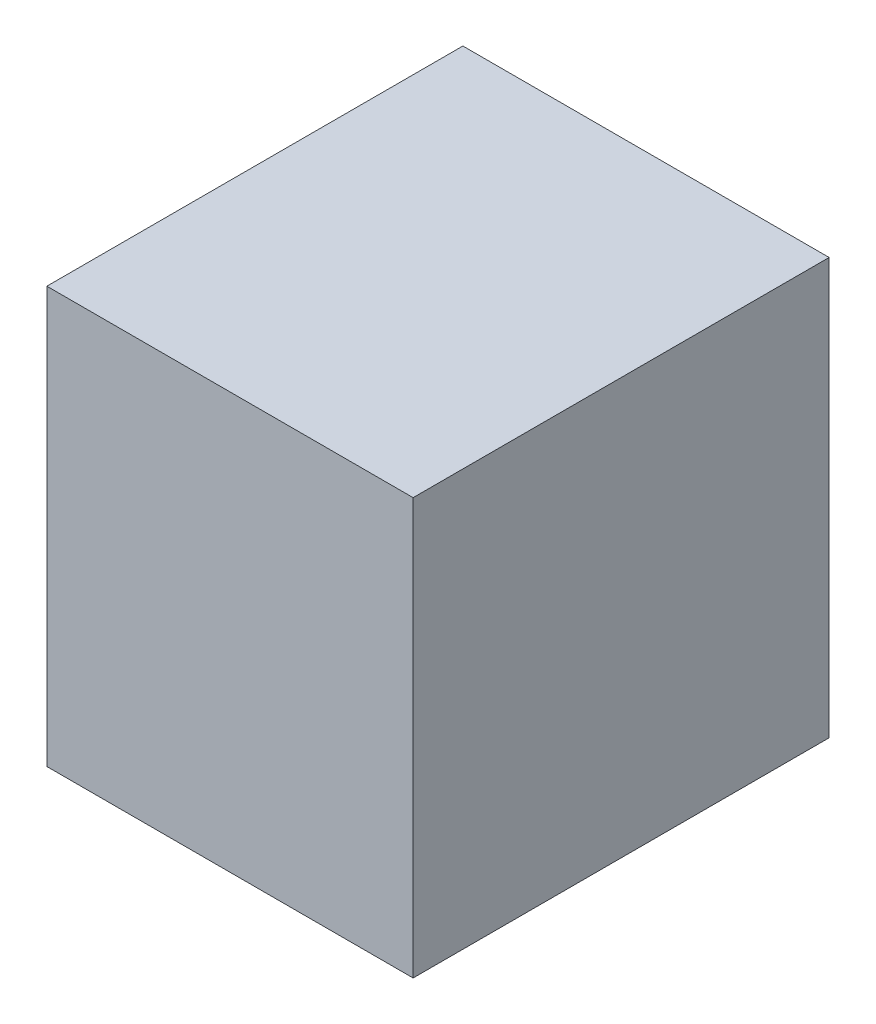
ISO-10303-21;
HEADER;
FILE_DESCRIPTION(('STEP AP214'),'2;1');
FILE_NAME('part.step','',(''),(''),'','','');
FILE_SCHEMA(('AUTOMOTIVE_DESIGN { 1 0 10303 214 1 1 1 1 }'));
ENDSEC;
DATA;
#1=APPLICATION_CONTEXT('core data for automotive mechanical design processes');
#2=APPLICATION_PROTOCOL_DEFINITION('international standard','automotive_design',2000,#1);
#3=PRODUCT_CONTEXT('',#1,'mechanical');
#4=PRODUCT('Part','Part','',(#3));
#5=PRODUCT_RELATED_PRODUCT_CATEGORY('part','',(#4));
#6=PRODUCT_DEFINITION_FORMATION('','',#4);
#7=PRODUCT_DEFINITION_CONTEXT('part definition',#1,'design');
#8=PRODUCT_DEFINITION('design','',#6,#7);
#9=PRODUCT_DEFINITION_SHAPE('','',#8);
#10=(LENGTH_UNIT() NAMED_UNIT(*) SI_UNIT(.MILLI.,.METRE.));
#11=(NAMED_UNIT(*) PLANE_ANGLE_UNIT() SI_UNIT($,.RADIAN.));
#12=(NAMED_UNIT(*) SI_UNIT($,.STERADIAN.) SOLID_ANGLE_UNIT());
#13=UNCERTAINTY_MEASURE_WITH_UNIT(LENGTH_MEASURE(1.E-05),#10,'distance_accuracy_value','');
#14=(GEOMETRIC_REPRESENTATION_CONTEXT(3) GLOBAL_UNCERTAINTY_ASSIGNED_CONTEXT((#13)) GLOBAL_UNIT_ASSIGNED_CONTEXT((#10,
#11,#12)) REPRESENTATION_CONTEXT('',''));
#15=CARTESIAN_POINT('',(0.,0.,0.));
#16=DIRECTION('',(0.,0.,1.));
#17=DIRECTION('',(1.,0.,0.));
#18=AXIS2_PLACEMENT_3D('',#15,#16,#17);
#19=CARTESIAN_POINT('',(86.25,200.,-100.));
#20=DIRECTION('',(-1.,0.,0.));
#21=DIRECTION('',(0.,0.,1.));
#22=AXIS2_PLACEMENT_3D('',#19,#20,#21);
#23=PLANE('',#22);
#24=DIRECTION('',(0.,0.,-1.));
#25=VECTOR('',#24,1.);
#26=CARTESIAN_POINT('',(86.25,0.,-100.));
#27=LINE('',#26,#25);
#28=CARTESIAN_POINT('',(86.25,0.,100.));
#29=VERTEX_POINT('',#28);
#30=CARTESIAN_POINT('',(86.25,0.,-100.));
#31=VERTEX_POINT('',#30);
#32=EDGE_CURVE('E141',#29,#31,#27,.T.);
#33=ORIENTED_EDGE('',*,*,#32,.F.);
#34=DIRECTION('',(0.,-1.,0.));
#35=VECTOR('',#34,1.);
#36=CARTESIAN_POINT('',(86.25,200.,100.));
#37=LINE('',#36,#35);
#38=CARTESIAN_POINT('',(86.25,200.,100.));
#39=VERTEX_POINT('',#38);
#40=EDGE_CURVE('E180',#39,#29,#37,.T.);
#41=ORIENTED_EDGE('',*,*,#40,.F.);
#42=DIRECTION('',(0.,0.,-1.));
#43=VECTOR('',#42,1.);
#44=CARTESIAN_POINT('',(86.25,200.,-100.));
#45=LINE('',#44,#43);
#46=CARTESIAN_POINT('',(86.25,200.,-100.));
#47=VERTEX_POINT('',#46);
#48=EDGE_CURVE('E166',#39,#47,#45,.T.);
#49=ORIENTED_EDGE('',*,*,#48,.T.);
#50=DIRECTION('',(0.,-1.,0.));
#51=VECTOR('',#50,1.);
#52=CARTESIAN_POINT('',(86.25,200.,-100.));
#53=LINE('',#52,#51);
#54=EDGE_CURVE('E177',#47,#31,#53,.T.);
#55=ORIENTED_EDGE('',*,*,#54,.T.);
#56=EDGE_LOOP('',(#33,#41,#49,#55));
#57=FACE_BOUND('',#56,.T.);
#58=ADVANCED_FACE('F41',(#57),#23,.T.);
#59=CARTESIAN_POINT('',(-86.25,200.,-100.));
#60=DIRECTION('',(0.,0.,1.));
#61=DIRECTION('',(1.,0.,0.));
#62=AXIS2_PLACEMENT_3D('',#59,#60,#61);
#63=PLANE('',#62);
#64=DIRECTION('',(-1.,0.,0.));
#65=VECTOR('',#64,1.);
#66=CARTESIAN_POINT('',(-86.25,0.,-100.));
#67=LINE('',#66,#65);
#68=CARTESIAN_POINT('',(-86.25,0.,-100.));
#69=VERTEX_POINT('',#68);
#70=EDGE_CURVE('E60',#31,#69,#67,.T.);
#71=ORIENTED_EDGE('',*,*,#70,.F.);
#72=ORIENTED_EDGE('',*,*,#54,.F.);
#73=DIRECTION('',(-1.,0.,0.));
#74=VECTOR('',#73,1.);
#75=CARTESIAN_POINT('',(-86.25,200.,-100.));
#76=LINE('',#75,#74);
#77=CARTESIAN_POINT('',(-86.25,200.,-100.));
#78=VERTEX_POINT('',#77);
#79=EDGE_CURVE('E83',#47,#78,#76,.T.);
#80=ORIENTED_EDGE('',*,*,#79,.T.);
#81=DIRECTION('',(0.,-1.,0.));
#82=VECTOR('',#81,1.);
#83=CARTESIAN_POINT('',(-86.25,200.,-100.));
#84=LINE('',#83,#82);
#85=EDGE_CURVE('E173',#78,#69,#84,.T.);
#86=ORIENTED_EDGE('',*,*,#85,.T.);
#87=EDGE_LOOP('',(#71,#72,#80,#86));
#88=FACE_BOUND('',#87,.T.);
#89=ADVANCED_FACE('F186',(#88),#63,.T.);
#90=CARTESIAN_POINT('',(-86.25,200.,-100.));
#91=DIRECTION('',(1.,0.,0.));
#92=DIRECTION('',(0.,0.,-1.));
#93=AXIS2_PLACEMENT_3D('',#90,#91,#92);
#94=PLANE('',#93);
#95=CARTESIAN_POINT('',(-86.25,98.9895952736163,1.01040472638368));
#96=DIRECTION('',(1.,0.,0.));
#97=DIRECTION('',(0.,0.,-1.));
#98=AXIS2_PLACEMENT_3D('',#95,#96,#97);
#99=CIRCLE('',#98,72.5);
#100=CARTESIAN_POINT('',(-86.25,98.9895952736163,-71.4895952736163));
#101=VERTEX_POINT('',#100);
#102=EDGE_CURVE('E45',#101,#101,#99,.T.);
#103=ORIENTED_EDGE('',*,*,#102,.F.);
#104=EDGE_LOOP('',(#103));
#105=FACE_BOUND('',#104,.T.);
#106=DIRECTION('',(0.,0.,1.));
#107=VECTOR('',#106,1.);
#108=CARTESIAN_POINT('',(-86.25,0.,-100.));
#109=LINE('',#108,#107);
#110=CARTESIAN_POINT('',(-86.25,0.,100.));
#111=VERTEX_POINT('',#110);
#112=EDGE_CURVE('E175',#69,#111,#109,.T.);
#113=ORIENTED_EDGE('',*,*,#112,.F.);
#114=ORIENTED_EDGE('',*,*,#85,.F.);
#115=DIRECTION('',(0.,0.,1.));
#116=VECTOR('',#115,1.);
#117=CARTESIAN_POINT('',(-86.25,200.,-100.));
#118=LINE('',#117,#116);
#119=CARTESIAN_POINT('',(-86.25,200.,100.));
#120=VERTEX_POINT('',#119);
#121=EDGE_CURVE('E51',#78,#120,#118,.T.);
#122=ORIENTED_EDGE('',*,*,#121,.T.);
#123=DIRECTION('',(0.,-1.,0.));
#124=VECTOR('',#123,1.);
#125=CARTESIAN_POINT('',(-86.25,200.,100.));
#126=LINE('',#125,#124);
#127=EDGE_CURVE('E168',#120,#111,#126,.T.);
#128=ORIENTED_EDGE('',*,*,#127,.T.);
#129=EDGE_LOOP('',(#113,#114,#122,#128));
#130=FACE_BOUND('',#129,.T.);
#131=ADVANCED_FACE('F190',(#105,#130),#94,.T.);
#132=CARTESIAN_POINT('',(-86.25,200.,100.));
#133=DIRECTION('',(0.,0.,-1.));
#134=DIRECTION('',(-1.,0.,0.));
#135=AXIS2_PLACEMENT_3D('',#132,#133,#134);
#136=PLANE('',#135);
#137=DIRECTION('',(1.,0.,0.));
#138=VECTOR('',#137,1.);
#139=CARTESIAN_POINT('',(-86.25,0.,100.));
#140=LINE('',#139,#138);
#141=EDGE_CURVE('E171',#111,#29,#140,.T.);
#142=ORIENTED_EDGE('',*,*,#141,.F.);
#143=ORIENTED_EDGE('',*,*,#127,.F.);
#144=DIRECTION('',(1.,0.,0.));
#145=VECTOR('',#144,1.);
#146=CARTESIAN_POINT('',(-86.25,200.,100.));
#147=LINE('',#146,#145);
#148=EDGE_CURVE('E11',#120,#39,#147,.T.);
#149=ORIENTED_EDGE('',*,*,#148,.T.);
#150=ORIENTED_EDGE('',*,*,#40,.T.);
#151=EDGE_LOOP('',(#142,#143,#149,#150));
#152=FACE_BOUND('',#151,.T.);
#153=ADVANCED_FACE('F195',(#152),#136,.T.);
#154=CARTESIAN_POINT('',(0.,200.,0.));
#155=DIRECTION('',(0.,1.,0.));
#156=DIRECTION('',(0.,0.,1.));
#157=AXIS2_PLACEMENT_3D('',#154,#155,#156);
#158=PLANE('',#157);
#159=ORIENTED_EDGE('',*,*,#48,.F.);
#160=ORIENTED_EDGE('',*,*,#148,.F.);
#161=ORIENTED_EDGE('',*,*,#121,.F.);
#162=ORIENTED_EDGE('',*,*,#79,.F.);
#163=EDGE_LOOP('',(#159,#160,#161,#162));
#164=FACE_BOUND('',#163,.T.);
#165=ADVANCED_FACE('F193',(#164),#158,.F.);
#166=CARTESIAN_POINT('',(0.,0.,0.));
#167=DIRECTION('',(0.,1.,0.));
#168=DIRECTION('',(0.,0.,1.));
#169=AXIS2_PLACEMENT_3D('',#166,#167,#168);
#170=PLANE('',#169);
#171=ORIENTED_EDGE('',*,*,#32,.T.);
#172=ORIENTED_EDGE('',*,*,#70,.T.);
#173=ORIENTED_EDGE('',*,*,#112,.T.);
#174=ORIENTED_EDGE('',*,*,#141,.T.);
#175=EDGE_LOOP('',(#171,#172,#173,#174));
#176=FACE_BOUND('',#175,.T.);
#177=ADVANCED_FACE('F43',(#176),#170,.T.);
#178=CARTESIAN_POINT('',(-76.75,98.9895952736163,1.01040472638368));
#179=DIRECTION('',(-1.,0.,0.));
#180=DIRECTION('',(0.,0.,1.));
#181=AXIS2_PLACEMENT_3D('',#178,#179,#180);
#182=CYLINDRICAL_SURFACE('',#181,72.5);
#183=ORIENTED_EDGE('',*,*,#102,.T.);
#184=EDGE_LOOP('',(#183));
#185=FACE_BOUND('',#184,.T.);
#186=CARTESIAN_POINT('',(-91.75,98.9895952736163,1.01040472638368));
#187=DIRECTION('',(-1.,0.,0.));
#188=DIRECTION('',(0.,0.,1.));
#189=AXIS2_PLACEMENT_3D('',#186,#187,#188);
#190=CIRCLE('',#189,72.5);
#191=CARTESIAN_POINT('',(-91.75,98.9895952736163,73.5104047263837));
#192=VERTEX_POINT('',#191);
#193=EDGE_CURVE('E246',#192,#192,#190,.T.);
#194=ORIENTED_EDGE('',*,*,#193,.T.);
#195=EDGE_LOOP('',(#194));
#196=FACE_BOUND('',#195,.T.);
#197=ADVANCED_FACE('F228',(#185,#196),#182,.F.);
#198=CARTESIAN_POINT('',(101.25,200.,-100.));
#199=DIRECTION('',(-1.,0.,0.));
#200=DIRECTION('',(0.,0.,1.));
#201=AXIS2_PLACEMENT_3D('',#198,#199,#200);
#202=PLANE('',#201);
#203=DIRECTION('',(0.,0.,-1.));
#204=VECTOR('',#203,1.);
#205=CARTESIAN_POINT('',(101.25,-15.,-100.));
#206=LINE('',#205,#204);
#207=CARTESIAN_POINT('',(101.25,-15.,115.));
#208=VERTEX_POINT('',#207);
#209=CARTESIAN_POINT('',(101.25,-15.,-115.));
#210=VERTEX_POINT('',#209);
#211=EDGE_CURVE('E133',#208,#210,#206,.T.);
#212=ORIENTED_EDGE('',*,*,#211,.T.);
#213=DIRECTION('',(0.,-1.,0.));
#214=VECTOR('',#213,1.);
#215=CARTESIAN_POINT('',(101.25,200.,-115.));
#216=LINE('',#215,#214);
#217=CARTESIAN_POINT('',(101.25,215.,-115.));
#218=VERTEX_POINT('',#217);
#219=EDGE_CURVE('E136',#218,#210,#216,.T.);
#220=ORIENTED_EDGE('',*,*,#219,.F.);
#221=DIRECTION('',(0.,0.,-1.));
#222=VECTOR('',#221,1.);
#223=CARTESIAN_POINT('',(101.25,215.,-100.));
#224=LINE('',#223,#222);
#225=CARTESIAN_POINT('',(101.25,215.,115.));
#226=VERTEX_POINT('',#225);
#227=EDGE_CURVE('E153',#226,#218,#224,.T.);
#228=ORIENTED_EDGE('',*,*,#227,.F.);
#229=DIRECTION('',(0.,-1.,0.));
#230=VECTOR('',#229,1.);
#231=CARTESIAN_POINT('',(101.25,200.,115.));
#232=LINE('',#231,#230);
#233=EDGE_CURVE('E145',#226,#208,#232,.T.);
#234=ORIENTED_EDGE('',*,*,#233,.T.);
#235=EDGE_LOOP('',(#212,#220,#228,#234));
#236=FACE_BOUND('',#235,.T.);
#237=ADVANCED_FACE('F144',(#236),#202,.F.);
#238=CARTESIAN_POINT('',(-86.25,200.,-115.));
#239=DIRECTION('',(0.,0.,1.));
#240=DIRECTION('',(1.,0.,0.));
#241=AXIS2_PLACEMENT_3D('',#238,#239,#240);
#242=PLANE('',#241);
#243=DIRECTION('',(-1.,0.,0.));
#244=VECTOR('',#243,1.);
#245=CARTESIAN_POINT('',(-86.25,-15.,-115.));
#246=LINE('',#245,#244);
#247=CARTESIAN_POINT('',(-101.25,-15.,-115.));
#248=VERTEX_POINT('',#247);
#249=EDGE_CURVE('E127',#210,#248,#246,.T.);
#250=ORIENTED_EDGE('',*,*,#249,.T.);
#251=DIRECTION('',(0.,-1.,0.));
#252=VECTOR('',#251,1.);
#253=CARTESIAN_POINT('',(-101.25,200.,-115.));
#254=LINE('',#253,#252);
#255=CARTESIAN_POINT('',(-101.25,215.,-115.));
#256=VERTEX_POINT('',#255);
#257=EDGE_CURVE('E142',#256,#248,#254,.T.);
#258=ORIENTED_EDGE('',*,*,#257,.F.);
#259=DIRECTION('',(-1.,0.,0.));
#260=VECTOR('',#259,1.);
#261=CARTESIAN_POINT('',(-86.25,215.,-115.));
#262=LINE('',#261,#260);
#263=EDGE_CURVE('E138',#218,#256,#262,.T.);
#264=ORIENTED_EDGE('',*,*,#263,.F.);
#265=ORIENTED_EDGE('',*,*,#219,.T.);
#266=EDGE_LOOP('',(#250,#258,#264,#265));
#267=FACE_BOUND('',#266,.T.);
#268=ADVANCED_FACE('F137',(#267),#242,.F.);
#269=CARTESIAN_POINT('',(-101.25,200.,-100.));
#270=DIRECTION('',(1.,0.,0.));
#271=DIRECTION('',(0.,0.,-1.));
#272=AXIS2_PLACEMENT_3D('',#269,#270,#271);
#273=PLANE('',#272);
#274=CARTESIAN_POINT('',(-101.25,100.,0.));
#275=DIRECTION('',(-1.,0.,0.));
#276=DIRECTION('',(0.,0.,1.));
#277=AXIS2_PLACEMENT_3D('',#274,#275,#276);
#278=CIRCLE('',#277,93.25);
#279=CARTESIAN_POINT('',(-101.25,100.,93.25));
#280=VERTEX_POINT('',#279);
#281=EDGE_CURVE('E149',#280,#280,#278,.T.);
#282=ORIENTED_EDGE('',*,*,#281,.F.);
#283=EDGE_LOOP('',(#282));
#284=FACE_BOUND('',#283,.T.);
#285=DIRECTION('',(0.,0.,1.));
#286=VECTOR('',#285,1.);
#287=CARTESIAN_POINT('',(-101.25,-15.,-100.));
#288=LINE('',#287,#286);
#289=CARTESIAN_POINT('',(-101.25,-15.,115.));
#290=VERTEX_POINT('',#289);
#291=EDGE_CURVE('E119',#248,#290,#288,.T.);
#292=ORIENTED_EDGE('',*,*,#291,.T.);
#293=DIRECTION('',(0.,-1.,0.));
#294=VECTOR('',#293,1.);
#295=CARTESIAN_POINT('',(-101.25,200.,115.));
#296=LINE('',#295,#294);
#297=CARTESIAN_POINT('',(-101.25,215.,115.));
#298=VERTEX_POINT('',#297);
#299=EDGE_CURVE('E155',#298,#290,#296,.T.);
#300=ORIENTED_EDGE('',*,*,#299,.F.);
#301=DIRECTION('',(0.,0.,1.));
#302=VECTOR('',#301,1.);
#303=CARTESIAN_POINT('',(-101.25,215.,-100.));
#304=LINE('',#303,#302);
#305=EDGE_CURVE('E99',#256,#298,#304,.T.);
#306=ORIENTED_EDGE('',*,*,#305,.F.);
#307=ORIENTED_EDGE('',*,*,#257,.T.);
#308=EDGE_LOOP('',(#292,#300,#306,#307));
#309=FACE_BOUND('',#308,.T.);
#310=ADVANCED_FACE('F220',(#284,#309),#273,.F.);
#311=CARTESIAN_POINT('',(-86.25,200.,115.));
#312=DIRECTION('',(0.,0.,-1.));
#313=DIRECTION('',(-1.,0.,0.));
#314=AXIS2_PLACEMENT_3D('',#311,#312,#313);
#315=PLANE('',#314);
#316=DIRECTION('',(1.,0.,0.));
#317=VECTOR('',#316,1.);
#318=CARTESIAN_POINT('',(-86.25,-15.,115.));
#319=LINE('',#318,#317);
#320=EDGE_CURVE('E110',#290,#208,#319,.T.);
#321=ORIENTED_EDGE('',*,*,#320,.T.);
#322=ORIENTED_EDGE('',*,*,#233,.F.);
#323=DIRECTION('',(1.,0.,0.));
#324=VECTOR('',#323,1.);
#325=CARTESIAN_POINT('',(-86.25,215.,115.));
#326=LINE('',#325,#324);
#327=EDGE_CURVE('E93',#298,#226,#326,.T.);
#328=ORIENTED_EDGE('',*,*,#327,.F.);
#329=ORIENTED_EDGE('',*,*,#299,.T.);
#330=EDGE_LOOP('',(#321,#322,#328,#329));
#331=FACE_BOUND('',#330,.T.);
#332=ADVANCED_FACE('F217',(#331),#315,.F.);
#333=CARTESIAN_POINT('',(0.,215.,0.));
#334=DIRECTION('',(0.,1.,0.));
#335=DIRECTION('',(0.,0.,1.));
#336=AXIS2_PLACEMENT_3D('',#333,#334,#335);
#337=PLANE('',#336);
#338=ORIENTED_EDGE('',*,*,#227,.T.);
#339=ORIENTED_EDGE('',*,*,#263,.T.);
#340=ORIENTED_EDGE('',*,*,#305,.T.);
#341=ORIENTED_EDGE('',*,*,#327,.T.);
#342=EDGE_LOOP('',(#338,#339,#340,#341));
#343=FACE_BOUND('',#342,.T.);
#344=ADVANCED_FACE('F214',(#343),#337,.T.);
#345=CARTESIAN_POINT('',(0.,-15.,0.));
#346=DIRECTION('',(0.,1.,0.));
#347=DIRECTION('',(0.,0.,1.));
#348=AXIS2_PLACEMENT_3D('',#345,#346,#347);
#349=PLANE('',#348);
#350=ORIENTED_EDGE('',*,*,#211,.F.);
#351=ORIENTED_EDGE('',*,*,#320,.F.);
#352=ORIENTED_EDGE('',*,*,#291,.F.);
#353=ORIENTED_EDGE('',*,*,#249,.F.);
#354=EDGE_LOOP('',(#350,#351,#352,#353));
#355=FACE_BOUND('',#354,.T.);
#356=ADVANCED_FACE('F131',(#355),#349,.F.);
#357=CARTESIAN_POINT('',(-91.75,100.,0.));
#358=DIRECTION('',(-1.,0.,0.));
#359=DIRECTION('',(0.,0.,1.));
#360=AXIS2_PLACEMENT_3D('',#357,#358,#359);
#361=CYLINDRICAL_SURFACE('',#360,93.25);
#362=CARTESIAN_POINT('',(-91.75,100.,0.));
#363=DIRECTION('',(-1.,0.,0.));
#364=DIRECTION('',(0.,0.,1.));
#365=AXIS2_PLACEMENT_3D('',#362,#363,#364);
#366=CIRCLE('',#365,93.25);
#367=CARTESIAN_POINT('',(-91.75,100.,93.25));
#368=VERTEX_POINT('',#367);
#369=EDGE_CURVE('E146',#368,#368,#366,.T.);
#370=ORIENTED_EDGE('',*,*,#369,.F.);
#371=EDGE_LOOP('',(#370));
#372=FACE_BOUND('',#371,.T.);
#373=ORIENTED_EDGE('',*,*,#281,.T.);
#374=EDGE_LOOP('',(#373));
#375=FACE_BOUND('',#374,.T.);
#376=ADVANCED_FACE('F213',(#372,#375),#361,.F.);
#377=CARTESIAN_POINT('',(-91.75,100.,0.));
#378=DIRECTION('',(-1.,0.,0.));
#379=DIRECTION('',(0.,0.,1.));
#380=AXIS2_PLACEMENT_3D('',#377,#378,#379);
#381=PLANE('',#380);
#382=ORIENTED_EDGE('',*,*,#193,.F.);
#383=EDGE_LOOP('',(#382));
#384=FACE_BOUND('',#383,.T.);
#385=ORIENTED_EDGE('',*,*,#369,.T.);
#386=EDGE_LOOP('',(#385));
#387=FACE_BOUND('',#386,.T.);
#388=ADVANCED_FACE('F231',(#384,#387),#381,.T.);
#389=CLOSED_SHELL('',(#58,#89,#131,#153,#165,#177,#197,#237,#268,#310,#332,#344,#356,#376,#388));
#390=MANIFOLD_SOLID_BREP('B2',#389);
#391=ADVANCED_BREP_SHAPE_REPRESENTATION('',(#18,#390),#14);
#392=SHAPE_DEFINITION_REPRESENTATION(#9,#391);
ENDSEC;
END-ISO-10303-21;
